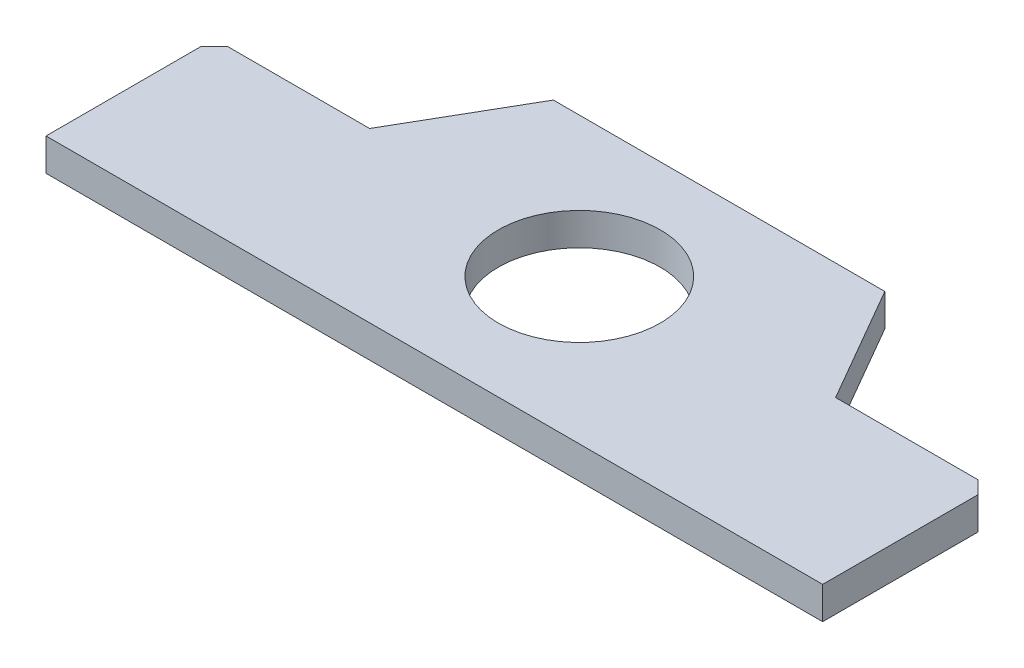
ISO-10303-21;
HEADER;
FILE_DESCRIPTION(('STEP AP214'),'2;1');
FILE_NAME('part.step','',(''),(''),'','','');
FILE_SCHEMA(('AUTOMOTIVE_DESIGN { 1 0 10303 214 1 1 1 1 }'));
ENDSEC;
DATA;
#1=APPLICATION_CONTEXT('core data for automotive mechanical design processes');
#2=APPLICATION_PROTOCOL_DEFINITION('international standard','automotive_design',2000,#1);
#3=PRODUCT_CONTEXT('',#1,'mechanical');
#4=PRODUCT('Part','Part','',(#3));
#5=PRODUCT_RELATED_PRODUCT_CATEGORY('part','',(#4));
#6=PRODUCT_DEFINITION_FORMATION('','',#4);
#7=PRODUCT_DEFINITION_CONTEXT('part definition',#1,'design');
#8=PRODUCT_DEFINITION('design','',#6,#7);
#9=PRODUCT_DEFINITION_SHAPE('','',#8);
#10=(LENGTH_UNIT() NAMED_UNIT(*) SI_UNIT(.MILLI.,.METRE.));
#11=(NAMED_UNIT(*) PLANE_ANGLE_UNIT() SI_UNIT($,.RADIAN.));
#12=(NAMED_UNIT(*) SI_UNIT($,.STERADIAN.) SOLID_ANGLE_UNIT());
#13=UNCERTAINTY_MEASURE_WITH_UNIT(LENGTH_MEASURE(1.E-05),#10,'distance_accuracy_value','');
#14=(GEOMETRIC_REPRESENTATION_CONTEXT(3) GLOBAL_UNCERTAINTY_ASSIGNED_CONTEXT((#13)) GLOBAL_UNIT_ASSIGNED_CONTEXT((#10,
#11,#12)) REPRESENTATION_CONTEXT('',''));
#15=CARTESIAN_POINT('',(0.,0.,0.));
#16=DIRECTION('',(0.,0.,1.));
#17=DIRECTION('',(1.,0.,0.));
#18=AXIS2_PLACEMENT_3D('',#15,#16,#17);
#19=CARTESIAN_POINT('',(0.,25.,0.));
#20=DIRECTION('',(0.,-1.,0.));
#21=DIRECTION('',(0.,0.,-1.));
#22=AXIS2_PLACEMENT_3D('',#19,#20,#21);
#23=PLANE('',#22);
#24=DIRECTION('',(-0.70710678118655,0.,-0.707106781186546));
#25=VECTOR('',#24,1.);
#26=CARTESIAN_POINT('',(300.,25.0000000000004,-10.));
#27=LINE('',#26,#25);
#28=CARTESIAN_POINT('',(290.,25.,-20.));
#29=VERTEX_POINT('',#28);
#30=CARTESIAN_POINT('',(300.,25.,-10.));
#31=VERTEX_POINT('',#30);
#32=EDGE_CURVE('E92',#29,#31,#27,.F.);
#33=ORIENTED_EDGE('',*,*,#32,.F.);
#34=DIRECTION('',(1.,0.,0.));
#35=VECTOR('',#34,1.);
#36=CARTESIAN_POINT('',(300.,25.,-20.));
#37=LINE('',#36,#35);
#38=CARTESIAN_POINT('',(180.,25.,-20.));
#39=VERTEX_POINT('',#38);
#40=EDGE_CURVE('E97',#29,#39,#37,.F.);
#41=ORIENTED_EDGE('',*,*,#40,.T.);
#42=DIRECTION('',(0.5,0.,0.86602540378444));
#43=VECTOR('',#42,1.);
#44=CARTESIAN_POINT('',(180.,25.,-19.9999999999993));
#45=LINE('',#44,#43);
#46=CARTESIAN_POINT('',(128.038475772934,25.,-110.));
#47=VERTEX_POINT('',#46);
#48=EDGE_CURVE('E124',#39,#47,#45,.F.);
#49=ORIENTED_EDGE('',*,*,#48,.T.);
#50=DIRECTION('',(1.,0.,0.));
#51=VECTOR('',#50,1.);
#52=CARTESIAN_POINT('',(-400.,25.,-110.));
#53=LINE('',#52,#51);
#54=CARTESIAN_POINT('',(-128.038475772934,25.,-110.));
#55=VERTEX_POINT('',#54);
#56=EDGE_CURVE('E130',#47,#55,#53,.F.);
#57=ORIENTED_EDGE('',*,*,#56,.T.);
#58=DIRECTION('',(0.5,0.,-0.86602540378444));
#59=VECTOR('',#58,1.);
#60=CARTESIAN_POINT('',(-128.038475772934,25.,-110.));
#61=LINE('',#60,#59);
#62=CARTESIAN_POINT('',(-180.,25.,-20.));
#63=VERTEX_POINT('',#62);
#64=EDGE_CURVE('E137',#55,#63,#61,.F.);
#65=ORIENTED_EDGE('',*,*,#64,.T.);
#66=DIRECTION('',(1.,0.,0.));
#67=VECTOR('',#66,1.);
#68=CARTESIAN_POINT('',(-300.,25.,-20.));
#69=LINE('',#68,#67);
#70=CARTESIAN_POINT('',(-290.,25.,-20.));
#71=VERTEX_POINT('',#70);
#72=EDGE_CURVE('E141',#63,#71,#69,.F.);
#73=ORIENTED_EDGE('',*,*,#72,.T.);
#74=DIRECTION('',(-0.707106781186546,0.,0.70710678118655));
#75=VECTOR('',#74,1.);
#76=CARTESIAN_POINT('',(-290.,25.,-20.));
#77=LINE('',#76,#75);
#78=CARTESIAN_POINT('',(-300.,25.,-9.99999999999988));
#79=VERTEX_POINT('',#78);
#80=EDGE_CURVE('E143',#79,#71,#77,.F.);
#81=ORIENTED_EDGE('',*,*,#80,.F.);
#82=DIRECTION('',(0.,0.,1.));
#83=VECTOR('',#82,1.);
#84=CARTESIAN_POINT('',(-300.,25.,-20.));
#85=LINE('',#84,#83);
#86=CARTESIAN_POINT('',(-300.,25.,110.));
#87=VERTEX_POINT('',#86);
#88=EDGE_CURVE('E152',#87,#79,#85,.F.);
#89=ORIENTED_EDGE('',*,*,#88,.F.);
#90=DIRECTION('',(-1.,0.,0.));
#91=VECTOR('',#90,1.);
#92=CARTESIAN_POINT('',(-400.,25.,110.));
#93=LINE('',#92,#91);
#94=CARTESIAN_POINT('',(300.,25.,110.));
#95=VERTEX_POINT('',#94);
#96=EDGE_CURVE('E156',#87,#95,#93,.F.);
#97=ORIENTED_EDGE('',*,*,#96,.T.);
#98=DIRECTION('',(0.,0.,-1.));
#99=VECTOR('',#98,1.);
#100=CARTESIAN_POINT('',(300.,25.,110.));
#101=LINE('',#100,#99);
#102=EDGE_CURVE('E108',#31,#95,#101,.F.);
#103=ORIENTED_EDGE('',*,*,#102,.F.);
#104=EDGE_LOOP('',(#33,#41,#49,#57,#65,#73,#81,#89,#97,#103));
#105=FACE_BOUND('',#104,.T.);
#106=CARTESIAN_POINT('',(0.,25.,-2.));
#107=DIRECTION('',(0.,1.,0.));
#108=DIRECTION('',(0.,0.,1.));
#109=AXIS2_PLACEMENT_3D('',#106,#107,#108);
#110=CIRCLE('',#109,62.5);
#111=CARTESIAN_POINT('',(0.,25.,60.5));
#112=VERTEX_POINT('',#111);
#113=EDGE_CURVE('E20',#112,#112,#110,.F.);
#114=ORIENTED_EDGE('',*,*,#113,.T.);
#115=EDGE_LOOP('',(#114));
#116=FACE_BOUND('',#115,.T.);
#117=ADVANCED_FACE('F17',(#105,#116),#23,.F.);
#118=CARTESIAN_POINT('',(0.,0.,-2.));
#119=DIRECTION('',(0.,1.,0.));
#120=DIRECTION('',(0.,0.,1.));
#121=AXIS2_PLACEMENT_3D('',#118,#119,#120);
#122=CYLINDRICAL_SURFACE('',#121,62.5);
#123=ORIENTED_EDGE('',*,*,#113,.F.);
#124=EDGE_LOOP('',(#123));
#125=FACE_BOUND('',#124,.T.);
#126=CARTESIAN_POINT('',(0.,0.,-2.));
#127=DIRECTION('',(0.,1.,0.));
#128=DIRECTION('',(0.,0.,1.));
#129=AXIS2_PLACEMENT_3D('',#126,#127,#128);
#130=CIRCLE('',#129,62.5);
#131=CARTESIAN_POINT('',(0.,0.,60.5));
#132=VERTEX_POINT('',#131);
#133=EDGE_CURVE('E118',#132,#132,#130,.T.);
#134=ORIENTED_EDGE('',*,*,#133,.F.);
#135=EDGE_LOOP('',(#134));
#136=FACE_BOUND('',#135,.T.);
#137=ADVANCED_FACE('F228',(#125,#136),#122,.F.);
#138=CARTESIAN_POINT('',(300.,0.,-20.));
#139=DIRECTION('',(0.,0.,1.));
#140=DIRECTION('',(1.,0.,0.));
#141=AXIS2_PLACEMENT_3D('',#138,#139,#140);
#142=PLANE('',#141);
#143=DIRECTION('',(0.,1.,0.));
#144=VECTOR('',#143,1.);
#145=CARTESIAN_POINT('',(290.,-1037.59412223663,-20.));
#146=LINE('',#145,#144);
#147=CARTESIAN_POINT('',(290.,1.66533453693773E-13,-20.));
#148=VERTEX_POINT('',#147);
#149=EDGE_CURVE('E99',#148,#29,#146,.T.);
#150=ORIENTED_EDGE('',*,*,#149,.F.);
#151=DIRECTION('',(1.,0.,0.));
#152=VECTOR('',#151,1.);
#153=CARTESIAN_POINT('',(0.,0.,-20.));
#154=LINE('',#153,#152);
#155=CARTESIAN_POINT('',(180.,0.,-20.));
#156=VERTEX_POINT('',#155);
#157=EDGE_CURVE('E120',#156,#148,#154,.T.);
#158=ORIENTED_EDGE('',*,*,#157,.F.);
#159=DIRECTION('',(0.,1.,0.));
#160=VECTOR('',#159,1.);
#161=CARTESIAN_POINT('',(180.,0.,-20.));
#162=LINE('',#161,#160);
#163=EDGE_CURVE('E102',#156,#39,#162,.T.);
#164=ORIENTED_EDGE('',*,*,#163,.T.);
#165=ORIENTED_EDGE('',*,*,#40,.F.);
#166=EDGE_LOOP('',(#150,#158,#164,#165));
#167=FACE_BOUND('',#166,.T.);
#168=ADVANCED_FACE('F98',(#167),#142,.F.);
#169=CARTESIAN_POINT('',(300.,-1037.59412223663,-10.));
#170=DIRECTION('',(0.707106781186546,0.,-0.70710678118655));
#171=DIRECTION('',(-0.70710678118655,0.,-0.707106781186546));
#172=AXIS2_PLACEMENT_3D('',#169,#170,#171);
#173=PLANE('',#172);
#174=ORIENTED_EDGE('',*,*,#32,.T.);
#175=DIRECTION('',(0.,1.,0.));
#176=VECTOR('',#175,1.);
#177=CARTESIAN_POINT('',(300.,-1037.59412223663,-10.));
#178=LINE('',#177,#176);
#179=CARTESIAN_POINT('',(300.,3.33066907387547E-13,-10.));
#180=VERTEX_POINT('',#179);
#181=EDGE_CURVE('E110',#180,#31,#178,.T.);
#182=ORIENTED_EDGE('',*,*,#181,.F.);
#183=DIRECTION('',(0.707106781186549,0.,0.707106781186546));
#184=VECTOR('',#183,1.);
#185=CARTESIAN_POINT('',(290.,0.,-20.));
#186=LINE('',#185,#184);
#187=EDGE_CURVE('E114',#148,#180,#186,.T.);
#188=ORIENTED_EDGE('',*,*,#187,.F.);
#189=ORIENTED_EDGE('',*,*,#149,.T.);
#190=EDGE_LOOP('',(#174,#182,#188,#189));
#191=FACE_BOUND('',#190,.T.);
#192=ADVANCED_FACE('F112',(#191),#173,.T.);
#193=CARTESIAN_POINT('',(300.,-1037.59412223663,110.));
#194=DIRECTION('',(1.,0.,0.));
#195=DIRECTION('',(0.,0.,-1.));
#196=AXIS2_PLACEMENT_3D('',#193,#194,#195);
#197=PLANE('',#196);
#198=ORIENTED_EDGE('',*,*,#102,.T.);
#199=DIRECTION('',(0.,1.,0.));
#200=VECTOR('',#199,1.);
#201=CARTESIAN_POINT('',(300.,25.,110.));
#202=LINE('',#201,#200);
#203=CARTESIAN_POINT('',(300.,0.,110.));
#204=VERTEX_POINT('',#203);
#205=EDGE_CURVE('E154',#95,#204,#202,.F.);
#206=ORIENTED_EDGE('',*,*,#205,.T.);
#207=DIRECTION('',(0.,0.,-1.));
#208=VECTOR('',#207,1.);
#209=CARTESIAN_POINT('',(300.,0.,0.));
#210=LINE('',#209,#208);
#211=EDGE_CURVE('E163',#180,#204,#210,.F.);
#212=ORIENTED_EDGE('',*,*,#211,.F.);
#213=ORIENTED_EDGE('',*,*,#181,.T.);
#214=EDGE_LOOP('',(#198,#206,#212,#213));
#215=FACE_BOUND('',#214,.T.);
#216=ADVANCED_FACE('F160',(#215),#197,.T.);
#217=CARTESIAN_POINT('',(-400.,25.,110.));
#218=DIRECTION('',(0.,0.,-1.));
#219=DIRECTION('',(-1.,0.,0.));
#220=AXIS2_PLACEMENT_3D('',#217,#218,#219);
#221=PLANE('',#220);
#222=DIRECTION('',(1.,0.,0.));
#223=VECTOR('',#222,1.);
#224=CARTESIAN_POINT('',(0.,0.,110.));
#225=LINE('',#224,#223);
#226=CARTESIAN_POINT('',(-300.,0.,110.));
#227=VERTEX_POINT('',#226);
#228=EDGE_CURVE('E167',#204,#227,#225,.F.);
#229=ORIENTED_EDGE('',*,*,#228,.F.);
#230=ORIENTED_EDGE('',*,*,#205,.F.);
#231=ORIENTED_EDGE('',*,*,#96,.F.);
#232=DIRECTION('',(0.,1.,0.));
#233=VECTOR('',#232,1.);
#234=CARTESIAN_POINT('',(-300.,-1037.59412223663,110.));
#235=LINE('',#234,#233);
#236=EDGE_CURVE('E149',#227,#87,#235,.T.);
#237=ORIENTED_EDGE('',*,*,#236,.F.);
#238=EDGE_LOOP('',(#229,#230,#231,#237));
#239=FACE_BOUND('',#238,.T.);
#240=ADVANCED_FACE('F218',(#239),#221,.F.);
#241=CARTESIAN_POINT('',(-300.,-1037.59412223663,-20.));
#242=DIRECTION('',(-1.,0.,0.));
#243=DIRECTION('',(0.,0.,1.));
#244=AXIS2_PLACEMENT_3D('',#241,#242,#243);
#245=PLANE('',#244);
#246=DIRECTION('',(0.,0.,-1.));
#247=VECTOR('',#246,1.);
#248=CARTESIAN_POINT('',(-300.,0.,0.));
#249=LINE('',#248,#247);
#250=CARTESIAN_POINT('',(-300.,0.,-9.99999999999987));
#251=VERTEX_POINT('',#250);
#252=EDGE_CURVE('E173',#227,#251,#249,.T.);
#253=ORIENTED_EDGE('',*,*,#252,.F.);
#254=ORIENTED_EDGE('',*,*,#236,.T.);
#255=ORIENTED_EDGE('',*,*,#88,.T.);
#256=DIRECTION('',(0.,1.,0.));
#257=VECTOR('',#256,1.);
#258=CARTESIAN_POINT('',(-300.,0.,-9.99999999999987));
#259=LINE('',#258,#257);
#260=EDGE_CURVE('E146',#251,#79,#259,.T.);
#261=ORIENTED_EDGE('',*,*,#260,.F.);
#262=EDGE_LOOP('',(#253,#254,#255,#261));
#263=FACE_BOUND('',#262,.T.);
#264=ADVANCED_FACE('F214',(#263),#245,.T.);
#265=CARTESIAN_POINT('',(-290.,0.,-20.));
#266=DIRECTION('',(-0.70710678118655,0.,-0.707106781186546));
#267=DIRECTION('',(-0.707106781186546,0.,0.70710678118655));
#268=AXIS2_PLACEMENT_3D('',#265,#266,#267);
#269=PLANE('',#268);
#270=ORIENTED_EDGE('',*,*,#80,.T.);
#271=DIRECTION('',(0.,1.,0.));
#272=VECTOR('',#271,1.);
#273=CARTESIAN_POINT('',(-290.,0.,-20.));
#274=LINE('',#273,#272);
#275=CARTESIAN_POINT('',(-290.,0.,-20.));
#276=VERTEX_POINT('',#275);
#277=EDGE_CURVE('E139',#71,#276,#274,.F.);
#278=ORIENTED_EDGE('',*,*,#277,.T.);
#279=DIRECTION('',(0.707106781186546,0.,-0.707106781186549));
#280=VECTOR('',#279,1.);
#281=CARTESIAN_POINT('',(-300.,0.,-9.99999999999984));
#282=LINE('',#281,#280);
#283=EDGE_CURVE('E176',#251,#276,#282,.T.);
#284=ORIENTED_EDGE('',*,*,#283,.F.);
#285=ORIENTED_EDGE('',*,*,#260,.T.);
#286=EDGE_LOOP('',(#270,#278,#284,#285));
#287=FACE_BOUND('',#286,.T.);
#288=ADVANCED_FACE('F210',(#287),#269,.T.);
#289=CARTESIAN_POINT('',(-300.,0.,-20.));
#290=DIRECTION('',(0.,0.,1.));
#291=DIRECTION('',(1.,0.,0.));
#292=AXIS2_PLACEMENT_3D('',#289,#290,#291);
#293=PLANE('',#292);
#294=ORIENTED_EDGE('',*,*,#277,.F.);
#295=ORIENTED_EDGE('',*,*,#72,.F.);
#296=DIRECTION('',(0.,1.,0.));
#297=VECTOR('',#296,1.);
#298=CARTESIAN_POINT('',(-180.,25.,-20.));
#299=LINE('',#298,#297);
#300=CARTESIAN_POINT('',(-180.,0.,-20.));
#301=VERTEX_POINT('',#300);
#302=EDGE_CURVE('E135',#63,#301,#299,.F.);
#303=ORIENTED_EDGE('',*,*,#302,.T.);
#304=DIRECTION('',(1.,0.,0.));
#305=VECTOR('',#304,1.);
#306=CARTESIAN_POINT('',(0.,0.,-20.));
#307=LINE('',#306,#305);
#308=EDGE_CURVE('E179',#276,#301,#307,.T.);
#309=ORIENTED_EDGE('',*,*,#308,.F.);
#310=EDGE_LOOP('',(#294,#295,#303,#309));
#311=FACE_BOUND('',#310,.T.);
#312=ADVANCED_FACE('F207',(#311),#293,.F.);
#313=CARTESIAN_POINT('',(-128.038475772934,25.,-110.));
#314=DIRECTION('',(0.86602540378444,0.,0.5));
#315=DIRECTION('',(0.5,0.,-0.86602540378444));
#316=AXIS2_PLACEMENT_3D('',#313,#314,#315);
#317=PLANE('',#316);
#318=ORIENTED_EDGE('',*,*,#302,.F.);
#319=ORIENTED_EDGE('',*,*,#64,.F.);
#320=DIRECTION('',(0.,1.,0.));
#321=VECTOR('',#320,1.);
#322=CARTESIAN_POINT('',(-128.038475772934,25.,-110.));
#323=LINE('',#322,#321);
#324=CARTESIAN_POINT('',(-128.038475772934,0.,-110.));
#325=VERTEX_POINT('',#324);
#326=EDGE_CURVE('E133',#55,#325,#323,.F.);
#327=ORIENTED_EDGE('',*,*,#326,.T.);
#328=DIRECTION('',(0.5,0.,-0.866025403784439));
#329=VECTOR('',#328,1.);
#330=CARTESIAN_POINT('',(-180.,0.,-20.));
#331=LINE('',#330,#329);
#332=EDGE_CURVE('E182',#301,#325,#331,.T.);
#333=ORIENTED_EDGE('',*,*,#332,.F.);
#334=EDGE_LOOP('',(#318,#319,#327,#333));
#335=FACE_BOUND('',#334,.T.);
#336=ADVANCED_FACE('F190',(#335),#317,.F.);
#337=CARTESIAN_POINT('',(-400.,25.,-110.));
#338=DIRECTION('',(0.,0.,1.));
#339=DIRECTION('',(1.,0.,0.));
#340=AXIS2_PLACEMENT_3D('',#337,#338,#339);
#341=PLANE('',#340);
#342=DIRECTION('',(0.,1.,0.));
#343=VECTOR('',#342,1.);
#344=CARTESIAN_POINT('',(128.038475772934,0.,-110.));
#345=LINE('',#344,#343);
#346=CARTESIAN_POINT('',(128.038475772934,0.,-110.));
#347=VERTEX_POINT('',#346);
#348=EDGE_CURVE('E35',#47,#347,#345,.F.);
#349=ORIENTED_EDGE('',*,*,#348,.T.);
#350=DIRECTION('',(1.,0.,0.));
#351=VECTOR('',#350,1.);
#352=CARTESIAN_POINT('',(0.,0.,-110.));
#353=LINE('',#352,#351);
#354=EDGE_CURVE('E26',#325,#347,#353,.T.);
#355=ORIENTED_EDGE('',*,*,#354,.F.);
#356=ORIENTED_EDGE('',*,*,#326,.F.);
#357=ORIENTED_EDGE('',*,*,#56,.F.);
#358=EDGE_LOOP('',(#349,#355,#356,#357));
#359=FACE_BOUND('',#358,.T.);
#360=ADVANCED_FACE('F187',(#359),#341,.F.);
#361=CARTESIAN_POINT('',(180.,0.,-19.9999999999993));
#362=DIRECTION('',(-0.86602540378444,0.,0.5));
#363=DIRECTION('',(0.5,0.,0.86602540378444));
#364=AXIS2_PLACEMENT_3D('',#361,#362,#363);
#365=PLANE('',#364);
#366=ORIENTED_EDGE('',*,*,#348,.F.);
#367=ORIENTED_EDGE('',*,*,#48,.F.);
#368=ORIENTED_EDGE('',*,*,#163,.F.);
#369=DIRECTION('',(0.5,0.,0.866025403784438));
#370=VECTOR('',#369,1.);
#371=CARTESIAN_POINT('',(128.038475772934,0.,-110.));
#372=LINE('',#371,#370);
#373=EDGE_CURVE('E11',#347,#156,#372,.T.);
#374=ORIENTED_EDGE('',*,*,#373,.F.);
#375=EDGE_LOOP('',(#366,#367,#368,#374));
#376=FACE_BOUND('',#375,.T.);
#377=ADVANCED_FACE('F193',(#376),#365,.F.);
#378=CARTESIAN_POINT('',(0.,0.,0.));
#379=DIRECTION('',(0.,-1.,0.));
#380=DIRECTION('',(0.,0.,-1.));
#381=AXIS2_PLACEMENT_3D('',#378,#379,#380);
#382=PLANE('',#381);
#383=ORIENTED_EDGE('',*,*,#354,.T.);
#384=ORIENTED_EDGE('',*,*,#373,.T.);
#385=ORIENTED_EDGE('',*,*,#157,.T.);
#386=ORIENTED_EDGE('',*,*,#187,.T.);
#387=ORIENTED_EDGE('',*,*,#211,.T.);
#388=ORIENTED_EDGE('',*,*,#228,.T.);
#389=ORIENTED_EDGE('',*,*,#252,.T.);
#390=ORIENTED_EDGE('',*,*,#283,.T.);
#391=ORIENTED_EDGE('',*,*,#308,.T.);
#392=ORIENTED_EDGE('',*,*,#332,.T.);
#393=EDGE_LOOP('',(#383,#384,#385,#386,#387,#388,#389,#390,#391,#392));
#394=FACE_BOUND('',#393,.T.);
#395=ORIENTED_EDGE('',*,*,#133,.T.);
#396=EDGE_LOOP('',(#395));
#397=FACE_BOUND('',#396,.T.);
#398=ADVANCED_FACE('F170',(#394,#397),#382,.T.);
#399=CLOSED_SHELL('',(#117,#137,#168,#192,#216,#240,#264,#288,#312,#336,#360,#377,#398));
#400=MANIFOLD_SOLID_BREP('B1',#399);
#401=ADVANCED_BREP_SHAPE_REPRESENTATION('',(#18,#400),#14);
#402=SHAPE_DEFINITION_REPRESENTATION(#9,#401);
ENDSEC;
END-ISO-10303-21;
